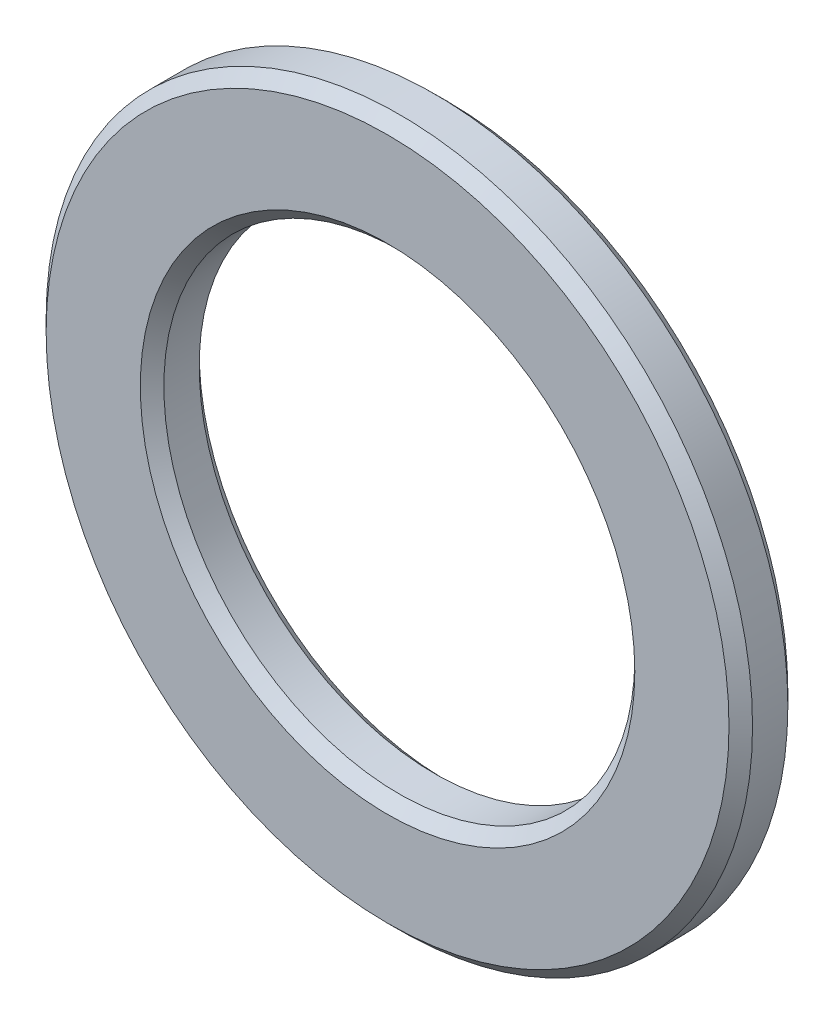
ISO-10303-21;
HEADER;
FILE_DESCRIPTION(('STEP AP214'),'2;1');
FILE_NAME('part.step','',(''),(''),'','','');
FILE_SCHEMA(('AUTOMOTIVE_DESIGN { 1 0 10303 214 1 1 1 1 }'));
ENDSEC;
DATA;
#1=APPLICATION_CONTEXT('core data for automotive mechanical design processes');
#2=APPLICATION_PROTOCOL_DEFINITION('international standard','automotive_design',2000,#1);
#3=PRODUCT_CONTEXT('',#1,'mechanical');
#4=PRODUCT('Part','Part','',(#3));
#5=PRODUCT_RELATED_PRODUCT_CATEGORY('part','',(#4));
#6=PRODUCT_DEFINITION_FORMATION('','',#4);
#7=PRODUCT_DEFINITION_CONTEXT('part definition',#1,'design');
#8=PRODUCT_DEFINITION('design','',#6,#7);
#9=PRODUCT_DEFINITION_SHAPE('','',#8);
#10=(LENGTH_UNIT() NAMED_UNIT(*) SI_UNIT(.MILLI.,.METRE.));
#11=(NAMED_UNIT(*) PLANE_ANGLE_UNIT() SI_UNIT($,.RADIAN.));
#12=(NAMED_UNIT(*) SI_UNIT($,.STERADIAN.) SOLID_ANGLE_UNIT());
#13=UNCERTAINTY_MEASURE_WITH_UNIT(LENGTH_MEASURE(1.E-05),#10,'distance_accuracy_value','');
#14=(GEOMETRIC_REPRESENTATION_CONTEXT(3) GLOBAL_UNCERTAINTY_ASSIGNED_CONTEXT((#13)) GLOBAL_UNIT_ASSIGNED_CONTEXT((#10,
#11,#12)) REPRESENTATION_CONTEXT('',''));
#15=CARTESIAN_POINT('',(0.,0.,0.));
#16=DIRECTION('',(0.,0.,1.));
#17=DIRECTION('',(1.,0.,0.));
#18=AXIS2_PLACEMENT_3D('',#15,#16,#17);
#19=CARTESIAN_POINT('',(0.,0.,0.25));
#20=DIRECTION('',(0.,0.,1.));
#21=DIRECTION('',(1.,0.,0.));
#22=AXIS2_PLACEMENT_3D('',#19,#20,#21);
#23=PLANE('',#22);
#24=CARTESIAN_POINT('',(0.,0.,0.25));
#25=DIRECTION('',(0.,0.,1.));
#26=DIRECTION('',(1.,0.,0.));
#27=AXIS2_PLACEMENT_3D('',#24,#25,#26);
#28=CIRCLE('',#27,2.1);
#29=CARTESIAN_POINT('',(2.1,0.,0.25));
#30=VERTEX_POINT('',#29);
#31=EDGE_CURVE('E56',#30,#30,#28,.F.);
#32=ORIENTED_EDGE('',*,*,#31,.T.);
#33=EDGE_LOOP('',(#32));
#34=FACE_BOUND('',#33,.T.);
#35=CARTESIAN_POINT('',(0.,0.,0.25));
#36=DIRECTION('',(0.,0.,1.));
#37=DIRECTION('',(1.,0.,0.));
#38=AXIS2_PLACEMENT_3D('',#35,#36,#37);
#39=CIRCLE('',#38,2.9);
#40=CARTESIAN_POINT('',(2.9,0.,0.25));
#41=VERTEX_POINT('',#40);
#42=EDGE_CURVE('E59',#41,#41,#39,.T.);
#43=ORIENTED_EDGE('',*,*,#42,.T.);
#44=EDGE_LOOP('',(#43));
#45=FACE_BOUND('',#44,.T.);
#46=ADVANCED_FACE('F35',(#34,#45),#23,.T.);
#47=CARTESIAN_POINT('',(0.,0.,-0.25));
#48=DIRECTION('',(0.,0.,1.));
#49=DIRECTION('',(1.,0.,0.));
#50=AXIS2_PLACEMENT_3D('',#47,#48,#49);
#51=PLANE('',#50);
#52=CARTESIAN_POINT('',(0.,0.,-0.25));
#53=DIRECTION('',(0.,0.,1.));
#54=DIRECTION('',(1.,0.,0.));
#55=AXIS2_PLACEMENT_3D('',#52,#53,#54);
#56=CIRCLE('',#55,2.1);
#57=CARTESIAN_POINT('',(2.1,0.,-0.25));
#58=VERTEX_POINT('',#57);
#59=EDGE_CURVE('E47',#58,#58,#56,.T.);
#60=ORIENTED_EDGE('',*,*,#59,.T.);
#61=EDGE_LOOP('',(#60));
#62=FACE_BOUND('',#61,.T.);
#63=CARTESIAN_POINT('',(0.,0.,-0.25));
#64=DIRECTION('',(0.,0.,1.));
#65=DIRECTION('',(1.,0.,0.));
#66=AXIS2_PLACEMENT_3D('',#63,#64,#65);
#67=CIRCLE('',#66,2.9);
#68=CARTESIAN_POINT('',(2.9,0.,-0.25));
#69=VERTEX_POINT('',#68);
#70=EDGE_CURVE('E51',#69,#69,#67,.F.);
#71=ORIENTED_EDGE('',*,*,#70,.T.);
#72=EDGE_LOOP('',(#71));
#73=FACE_BOUND('',#72,.T.);
#74=ADVANCED_FACE('F79',(#62,#73),#51,.F.);
#75=CARTESIAN_POINT('',(0.,0.,0.25));
#76=DIRECTION('',(0.,0.,-1.));
#77=DIRECTION('',(-1.,0.,0.));
#78=AXIS2_PLACEMENT_3D('',#75,#76,#77);
#79=CYLINDRICAL_SURFACE('',#78,3.);
#80=CARTESIAN_POINT('',(0.,0.,-0.15));
#81=DIRECTION('',(0.,0.,1.));
#82=DIRECTION('',(1.,0.,0.));
#83=AXIS2_PLACEMENT_3D('',#80,#81,#82);
#84=CIRCLE('',#83,3.);
#85=CARTESIAN_POINT('',(3.,0.,-0.15));
#86=VERTEX_POINT('',#85);
#87=EDGE_CURVE('E10',#86,#86,#84,.T.);
#88=ORIENTED_EDGE('',*,*,#87,.T.);
#89=EDGE_LOOP('',(#88));
#90=FACE_BOUND('',#89,.T.);
#91=CARTESIAN_POINT('',(0.,0.,0.149999999999999));
#92=DIRECTION('',(0.,0.,1.));
#93=DIRECTION('',(1.,0.,0.));
#94=AXIS2_PLACEMENT_3D('',#91,#92,#93);
#95=CIRCLE('',#94,3.);
#96=CARTESIAN_POINT('',(3.,0.,0.149999999999999));
#97=VERTEX_POINT('',#96);
#98=EDGE_CURVE('E43',#97,#97,#95,.F.);
#99=ORIENTED_EDGE('',*,*,#98,.T.);
#100=EDGE_LOOP('',(#99));
#101=FACE_BOUND('',#100,.T.);
#102=ADVANCED_FACE('F82',(#90,#101),#79,.T.);
#103=CARTESIAN_POINT('',(0.,0.,0.25));
#104=DIRECTION('',(0.,0.,-1.));
#105=DIRECTION('',(-1.,0.,0.));
#106=AXIS2_PLACEMENT_3D('',#103,#104,#105);
#107=CYLINDRICAL_SURFACE('',#106,2.);
#108=CARTESIAN_POINT('',(0.,0.,0.150000000000002));
#109=DIRECTION('',(0.,0.,1.));
#110=DIRECTION('',(1.,0.,0.));
#111=AXIS2_PLACEMENT_3D('',#108,#109,#110);
#112=CIRCLE('',#111,2.);
#113=CARTESIAN_POINT('',(2.,0.,0.150000000000002));
#114=VERTEX_POINT('',#113);
#115=EDGE_CURVE('E62',#114,#114,#112,.T.);
#116=ORIENTED_EDGE('',*,*,#115,.T.);
#117=EDGE_LOOP('',(#116));
#118=FACE_BOUND('',#117,.T.);
#119=CARTESIAN_POINT('',(0.,0.,-0.149999999999998));
#120=DIRECTION('',(0.,0.,1.));
#121=DIRECTION('',(1.,0.,0.));
#122=AXIS2_PLACEMENT_3D('',#119,#120,#121);
#123=CIRCLE('',#122,2.);
#124=CARTESIAN_POINT('',(2.,0.,-0.149999999999998));
#125=VERTEX_POINT('',#124);
#126=EDGE_CURVE('E65',#125,#125,#123,.F.);
#127=ORIENTED_EDGE('',*,*,#126,.T.);
#128=EDGE_LOOP('',(#127));
#129=FACE_BOUND('',#128,.T.);
#130=ADVANCED_FACE('F69',(#118,#129),#107,.F.);
#131=CARTESIAN_POINT('',(0.,0.,0.150000000000002));
#132=DIRECTION('',(0.,0.,1.));
#133=DIRECTION('',(1.,0.,0.));
#134=AXIS2_PLACEMENT_3D('',#131,#132,#133);
#135=CONICAL_SURFACE('',#134,2.,0.785398163397457);
#136=ORIENTED_EDGE('',*,*,#31,.F.);
#137=EDGE_LOOP('',(#136));
#138=FACE_BOUND('',#137,.T.);
#139=ORIENTED_EDGE('',*,*,#115,.F.);
#140=EDGE_LOOP('',(#139));
#141=FACE_BOUND('',#140,.T.);
#142=ADVANCED_FACE('F75',(#138,#141),#135,.F.);
#143=CARTESIAN_POINT('',(0.,0.,-0.25));
#144=DIRECTION('',(0.,0.,-1.));
#145=DIRECTION('',(-1.,0.,0.));
#146=AXIS2_PLACEMENT_3D('',#143,#144,#145);
#147=CONICAL_SURFACE('',#146,2.1,0.785398163397444);
#148=ORIENTED_EDGE('',*,*,#126,.F.);
#149=EDGE_LOOP('',(#148));
#150=FACE_BOUND('',#149,.T.);
#151=ORIENTED_EDGE('',*,*,#59,.F.);
#152=EDGE_LOOP('',(#151));
#153=FACE_BOUND('',#152,.T.);
#154=ADVANCED_FACE('F71',(#150,#153),#147,.F.);
#155=CARTESIAN_POINT('',(0.,0.,-0.15));
#156=DIRECTION('',(0.,0.,1.));
#157=DIRECTION('',(1.,0.,0.));
#158=AXIS2_PLACEMENT_3D('',#155,#156,#157);
#159=CONICAL_SURFACE('',#158,3.,0.785398163397453);
#160=ORIENTED_EDGE('',*,*,#70,.F.);
#161=EDGE_LOOP('',(#160));
#162=FACE_BOUND('',#161,.T.);
#163=ORIENTED_EDGE('',*,*,#87,.F.);
#164=EDGE_LOOP('',(#163));
#165=FACE_BOUND('',#164,.T.);
#166=ADVANCED_FACE('F74',(#162,#165),#159,.T.);
#167=CARTESIAN_POINT('',(0.,0.,0.25));
#168=DIRECTION('',(0.,0.,-1.));
#169=DIRECTION('',(-1.,0.,0.));
#170=AXIS2_PLACEMENT_3D('',#167,#168,#169);
#171=CONICAL_SURFACE('',#170,2.9,0.78539816339744);
#172=ORIENTED_EDGE('',*,*,#98,.F.);
#173=EDGE_LOOP('',(#172));
#174=FACE_BOUND('',#173,.T.);
#175=ORIENTED_EDGE('',*,*,#42,.F.);
#176=EDGE_LOOP('',(#175));
#177=FACE_BOUND('',#176,.T.);
#178=ADVANCED_FACE('F38',(#174,#177),#171,.T.);
#179=CLOSED_SHELL('',(#46,#74,#102,#130,#142,#154,#166,#178));
#180=MANIFOLD_SOLID_BREP('B2',#179);
#181=ADVANCED_BREP_SHAPE_REPRESENTATION('',(#18,#180),#14);
#182=SHAPE_DEFINITION_REPRESENTATION(#9,#181);
ENDSEC;
END-ISO-10303-21;
